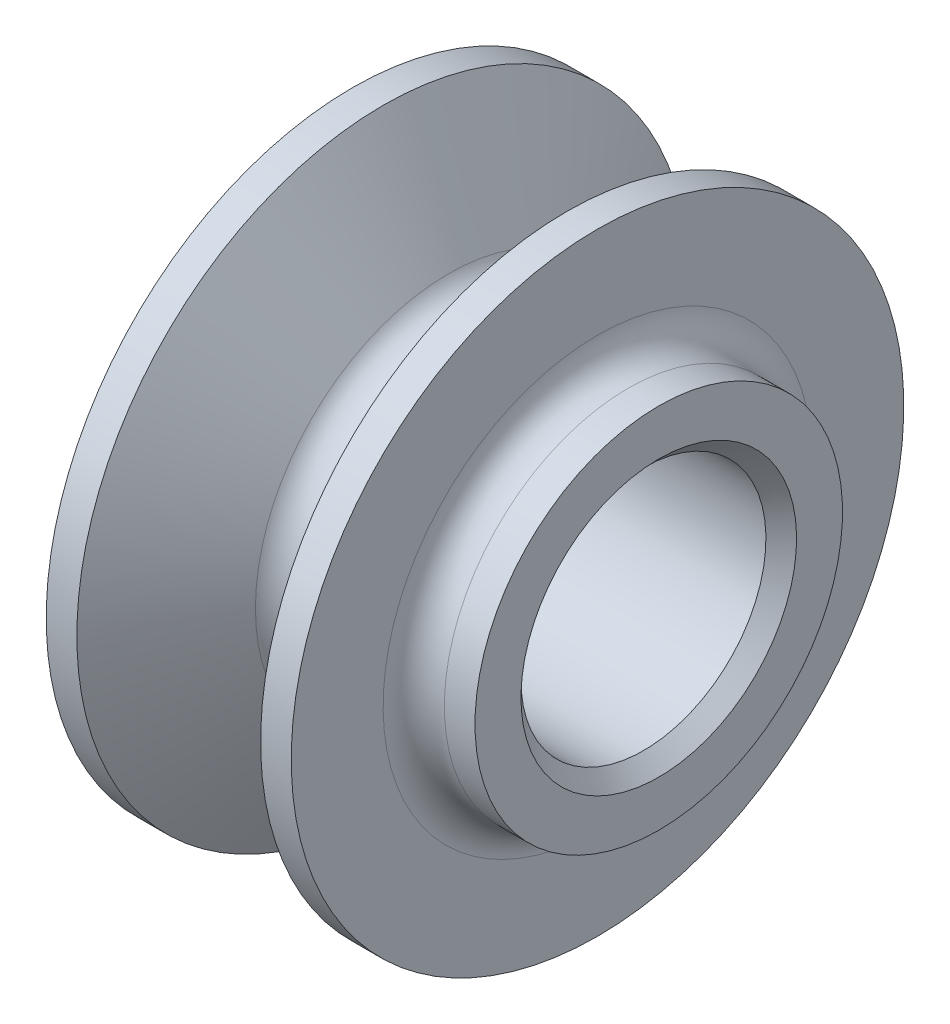
ISO-10303-21;
HEADER;
FILE_DESCRIPTION(('STEP AP214'),'2;1');
FILE_NAME('part.step','',(''),(''),'','','');
FILE_SCHEMA(('AUTOMOTIVE_DESIGN { 1 0 10303 214 1 1 1 1 }'));
ENDSEC;
DATA;
#1=APPLICATION_CONTEXT('core data for automotive mechanical design processes');
#2=APPLICATION_PROTOCOL_DEFINITION('international standard','automotive_design',2000,#1);
#3=PRODUCT_CONTEXT('',#1,'mechanical');
#4=PRODUCT('Part','Part','',(#3));
#5=PRODUCT_RELATED_PRODUCT_CATEGORY('part','',(#4));
#6=PRODUCT_DEFINITION_FORMATION('','',#4);
#7=PRODUCT_DEFINITION_CONTEXT('part definition',#1,'design');
#8=PRODUCT_DEFINITION('design','',#6,#7);
#9=PRODUCT_DEFINITION_SHAPE('','',#8);
#10=(LENGTH_UNIT() NAMED_UNIT(*) SI_UNIT(.MILLI.,.METRE.));
#11=(NAMED_UNIT(*) PLANE_ANGLE_UNIT() SI_UNIT($,.RADIAN.));
#12=(NAMED_UNIT(*) SI_UNIT($,.STERADIAN.) SOLID_ANGLE_UNIT());
#13=UNCERTAINTY_MEASURE_WITH_UNIT(LENGTH_MEASURE(1.E-05),#10,'distance_accuracy_value','');
#14=(GEOMETRIC_REPRESENTATION_CONTEXT(3) GLOBAL_UNCERTAINTY_ASSIGNED_CONTEXT((#13)) GLOBAL_UNIT_ASSIGNED_CONTEXT((#10,
#11,#12)) REPRESENTATION_CONTEXT('',''));
#15=CARTESIAN_POINT('',(0.,0.,0.));
#16=DIRECTION('',(0.,0.,1.));
#17=DIRECTION('',(1.,0.,0.));
#18=AXIS2_PLACEMENT_3D('',#15,#16,#17);
#19=CARTESIAN_POINT('',(0.,0.,0.));
#20=DIRECTION('',(1.,0.,0.));
#21=DIRECTION('',(0.,0.,-1.));
#22=AXIS2_PLACEMENT_3D('',#19,#20,#21);
#23=TOROIDAL_SURFACE('',#22,6.80384757729337,1.);
#24=CARTESIAN_POINT('',(-0.866025401573037,0.,0.));
#25=DIRECTION('',(-1.,0.,0.));
#26=DIRECTION('',(0.,1.,0.));
#27=AXIS2_PLACEMENT_3D('',#24,#25,#26);
#28=CIRCLE('',#27,6.30384757857013);
#29=CARTESIAN_POINT('',(-0.866025401573038,6.30384757857013,0.));
#30=VERTEX_POINT('',#29);
#31=EDGE_CURVE('E176',#30,#30,#28,.T.);
#32=ORIENTED_EDGE('',*,*,#31,.F.);
#33=EDGE_LOOP('',(#32));
#34=FACE_BOUND('',#33,.T.);
#35=CARTESIAN_POINT('',(0.866025401573036,0.,0.));
#36=DIRECTION('',(1.,0.,0.));
#37=DIRECTION('',(0.,1.,0.));
#38=AXIS2_PLACEMENT_3D('',#35,#36,#37);
#39=CIRCLE('',#38,6.30384757857013);
#40=CARTESIAN_POINT('',(0.866025401573034,6.30384757857013,0.));
#41=VERTEX_POINT('',#40);
#42=EDGE_CURVE('E173',#41,#41,#39,.T.);
#43=ORIENTED_EDGE('',*,*,#42,.F.);
#44=EDGE_LOOP('',(#43));
#45=FACE_BOUND('',#44,.T.);
#46=ADVANCED_FACE('F15',(#34,#45),#23,.F.);
#47=CARTESIAN_POINT('',(3.0000000022114,0.,0.));
#48=DIRECTION('',(1.,0.,0.));
#49=DIRECTION('',(0.,1.,0.));
#50=AXIS2_PLACEMENT_3D('',#47,#48,#49);
#51=CONICAL_SURFACE('',#50,9.99999999872325,1.04719755);
#52=CARTESIAN_POINT('',(3.,0.,0.));
#53=DIRECTION('',(1.,0.,0.));
#54=DIRECTION('',(0.,1.,0.));
#55=AXIS2_PLACEMENT_3D('',#52,#53,#54);
#56=CIRCLE('',#55,10.);
#57=CARTESIAN_POINT('',(3.,10.,0.));
#58=VERTEX_POINT('',#57);
#59=EDGE_CURVE('E181',#58,#58,#56,.T.);
#60=ORIENTED_EDGE('',*,*,#59,.F.);
#61=EDGE_LOOP('',(#60));
#62=FACE_BOUND('',#61,.T.);
#63=ORIENTED_EDGE('',*,*,#42,.T.);
#64=EDGE_LOOP('',(#63));
#65=FACE_BOUND('',#64,.T.);
#66=ADVANCED_FACE('F106',(#62,#65),#51,.T.);
#67=CARTESIAN_POINT('',(-3.00000000221141,0.,0.));
#68=DIRECTION('',(-1.,0.,0.));
#69=DIRECTION('',(0.,-1.,0.));
#70=AXIS2_PLACEMENT_3D('',#67,#68,#69);
#71=CONICAL_SURFACE('',#70,9.99999999872324,1.04719755);
#72=ORIENTED_EDGE('',*,*,#31,.T.);
#73=EDGE_LOOP('',(#72));
#74=FACE_BOUND('',#73,.T.);
#75=CARTESIAN_POINT('',(-3.,0.,0.));
#76=DIRECTION('',(1.,0.,0.));
#77=DIRECTION('',(0.,1.,0.));
#78=AXIS2_PLACEMENT_3D('',#75,#76,#77);
#79=CIRCLE('',#78,10.);
#80=CARTESIAN_POINT('',(-3.,10.,0.));
#81=VERTEX_POINT('',#80);
#82=EDGE_CURVE('E160',#81,#81,#79,.F.);
#83=ORIENTED_EDGE('',*,*,#82,.F.);
#84=EDGE_LOOP('',(#83));
#85=FACE_BOUND('',#84,.T.);
#86=ADVANCED_FACE('F103',(#74,#85),#71,.T.);
#87=CARTESIAN_POINT('',(3.5,0.,0.));
#88=DIRECTION('',(1.,0.,0.));
#89=DIRECTION('',(0.,1.,0.));
#90=AXIS2_PLACEMENT_3D('',#87,#88,#89);
#91=CYLINDRICAL_SURFACE('',#90,10.);
#92=ORIENTED_EDGE('',*,*,#59,.T.);
#93=EDGE_LOOP('',(#92));
#94=FACE_BOUND('',#93,.T.);
#95=CARTESIAN_POINT('',(4.,0.,0.));
#96=DIRECTION('',(1.,0.,0.));
#97=DIRECTION('',(0.,1.,0.));
#98=AXIS2_PLACEMENT_3D('',#95,#96,#97);
#99=CIRCLE('',#98,10.);
#100=CARTESIAN_POINT('',(4.,10.,0.));
#101=VERTEX_POINT('',#100);
#102=EDGE_CURVE('E19',#101,#101,#99,.T.);
#103=ORIENTED_EDGE('',*,*,#102,.F.);
#104=EDGE_LOOP('',(#103));
#105=FACE_BOUND('',#104,.T.);
#106=ADVANCED_FACE('F99',(#94,#105),#91,.T.);
#107=CARTESIAN_POINT('',(-3.5,0.,0.));
#108=DIRECTION('',(1.,0.,0.));
#109=DIRECTION('',(0.,1.,0.));
#110=AXIS2_PLACEMENT_3D('',#107,#108,#109);
#111=CYLINDRICAL_SURFACE('',#110,10.);
#112=CARTESIAN_POINT('',(-4.,0.,0.));
#113=DIRECTION('',(1.,0.,0.));
#114=DIRECTION('',(0.,1.,0.));
#115=AXIS2_PLACEMENT_3D('',#112,#113,#114);
#116=CIRCLE('',#115,10.);
#117=CARTESIAN_POINT('',(-4.,10.,0.));
#118=VERTEX_POINT('',#117);
#119=EDGE_CURVE('E155',#118,#118,#116,.F.);
#120=ORIENTED_EDGE('',*,*,#119,.F.);
#121=EDGE_LOOP('',(#120));
#122=FACE_BOUND('',#121,.T.);
#123=ORIENTED_EDGE('',*,*,#82,.T.);
#124=EDGE_LOOP('',(#123));
#125=FACE_BOUND('',#124,.T.);
#126=ADVANCED_FACE('F95',(#122,#125),#111,.T.);
#127=CARTESIAN_POINT('',(4.,8.5,0.));
#128=DIRECTION('',(1.,0.,0.));
#129=DIRECTION('',(0.,0.,-1.));
#130=AXIS2_PLACEMENT_3D('',#127,#128,#129);
#131=PLANE('',#130);
#132=CARTESIAN_POINT('',(4.,0.,0.));
#133=DIRECTION('',(1.,0.,0.));
#134=DIRECTION('',(0.,1.,0.));
#135=AXIS2_PLACEMENT_3D('',#132,#133,#134);
#136=CIRCLE('',#135,7.);
#137=CARTESIAN_POINT('',(4.,7.,0.));
#138=VERTEX_POINT('',#137);
#139=EDGE_CURVE('E79',#138,#138,#136,.F.);
#140=ORIENTED_EDGE('',*,*,#139,.T.);
#141=EDGE_LOOP('',(#140));
#142=FACE_BOUND('',#141,.T.);
#143=ORIENTED_EDGE('',*,*,#102,.T.);
#144=EDGE_LOOP('',(#143));
#145=FACE_BOUND('',#144,.T.);
#146=ADVANCED_FACE('F85',(#142,#145),#131,.T.);
#147=CARTESIAN_POINT('',(-4.,8.5,0.));
#148=DIRECTION('',(-1.,0.,0.));
#149=DIRECTION('',(0.,0.,1.));
#150=AXIS2_PLACEMENT_3D('',#147,#148,#149);
#151=PLANE('',#150);
#152=CARTESIAN_POINT('',(-4.,0.,0.));
#153=DIRECTION('',(-1.,0.,0.));
#154=DIRECTION('',(0.,1.,0.));
#155=AXIS2_PLACEMENT_3D('',#152,#153,#154);
#156=CIRCLE('',#155,7.);
#157=CARTESIAN_POINT('',(-4.,7.,0.));
#158=VERTEX_POINT('',#157);
#159=EDGE_CURVE('E44',#158,#158,#156,.F.);
#160=ORIENTED_EDGE('',*,*,#159,.T.);
#161=EDGE_LOOP('',(#160));
#162=FACE_BOUND('',#161,.T.);
#163=ORIENTED_EDGE('',*,*,#119,.T.);
#164=EDGE_LOOP('',(#163));
#165=FACE_BOUND('',#164,.T.);
#166=ADVANCED_FACE('F94',(#162,#165),#151,.T.);
#167=CARTESIAN_POINT('',(5.,0.,0.));
#168=DIRECTION('',(1.,0.,0.));
#169=DIRECTION('',(0.,0.,-1.));
#170=AXIS2_PLACEMENT_3D('',#167,#168,#169);
#171=TOROIDAL_SURFACE('',#170,7.,0.999999999999999);
#172=ORIENTED_EDGE('',*,*,#139,.F.);
#173=EDGE_LOOP('',(#172));
#174=FACE_BOUND('',#173,.T.);
#175=CARTESIAN_POINT('',(5.,0.,0.));
#176=DIRECTION('',(1.,0.,0.));
#177=DIRECTION('',(0.,1.,0.));
#178=AXIS2_PLACEMENT_3D('',#175,#176,#177);
#179=CIRCLE('',#178,6.);
#180=CARTESIAN_POINT('',(5.,6.00000000000001,0.));
#181=VERTEX_POINT('',#180);
#182=EDGE_CURVE('E39',#181,#181,#179,.T.);
#183=ORIENTED_EDGE('',*,*,#182,.F.);
#184=EDGE_LOOP('',(#183));
#185=FACE_BOUND('',#184,.T.);
#186=ADVANCED_FACE('F58',(#174,#185),#171,.F.);
#187=CARTESIAN_POINT('',(-5.,0.,0.));
#188=DIRECTION('',(1.,0.,0.));
#189=DIRECTION('',(0.,0.,-1.));
#190=AXIS2_PLACEMENT_3D('',#187,#188,#189);
#191=TOROIDAL_SURFACE('',#190,7.,0.999999999999999);
#192=CARTESIAN_POINT('',(-5.,0.,0.));
#193=DIRECTION('',(1.,0.,0.));
#194=DIRECTION('',(0.,1.,0.));
#195=AXIS2_PLACEMENT_3D('',#192,#193,#194);
#196=CIRCLE('',#195,6.);
#197=CARTESIAN_POINT('',(-5.,6.,0.));
#198=VERTEX_POINT('',#197);
#199=EDGE_CURVE('E35',#198,#198,#196,.F.);
#200=ORIENTED_EDGE('',*,*,#199,.F.);
#201=EDGE_LOOP('',(#200));
#202=FACE_BOUND('',#201,.T.);
#203=ORIENTED_EDGE('',*,*,#159,.F.);
#204=EDGE_LOOP('',(#203));
#205=FACE_BOUND('',#204,.T.);
#206=ADVANCED_FACE('F52',(#202,#205),#191,.F.);
#207=CARTESIAN_POINT('',(5.5,0.,0.));
#208=DIRECTION('',(1.,0.,0.));
#209=DIRECTION('',(0.,1.,0.));
#210=AXIS2_PLACEMENT_3D('',#207,#208,#209);
#211=CYLINDRICAL_SURFACE('',#210,6.);
#212=ORIENTED_EDGE('',*,*,#182,.T.);
#213=EDGE_LOOP('',(#212));
#214=FACE_BOUND('',#213,.T.);
#215=CARTESIAN_POINT('',(6.,0.,0.));
#216=DIRECTION('',(1.,0.,0.));
#217=DIRECTION('',(0.,1.,0.));
#218=AXIS2_PLACEMENT_3D('',#215,#216,#217);
#219=CIRCLE('',#218,6.);
#220=CARTESIAN_POINT('',(6.,6.00000000000001,0.));
#221=VERTEX_POINT('',#220);
#222=EDGE_CURVE('E38',#221,#221,#219,.T.);
#223=ORIENTED_EDGE('',*,*,#222,.F.);
#224=EDGE_LOOP('',(#223));
#225=FACE_BOUND('',#224,.T.);
#226=ADVANCED_FACE('F57',(#214,#225),#211,.T.);
#227=CARTESIAN_POINT('',(-5.5,0.,0.));
#228=DIRECTION('',(1.,0.,0.));
#229=DIRECTION('',(0.,1.,0.));
#230=AXIS2_PLACEMENT_3D('',#227,#228,#229);
#231=CYLINDRICAL_SURFACE('',#230,6.);
#232=CARTESIAN_POINT('',(-6.,0.,0.));
#233=DIRECTION('',(1.,0.,0.));
#234=DIRECTION('',(0.,1.,0.));
#235=AXIS2_PLACEMENT_3D('',#232,#233,#234);
#236=CIRCLE('',#235,6.);
#237=CARTESIAN_POINT('',(-6.,6.,0.));
#238=VERTEX_POINT('',#237);
#239=EDGE_CURVE('E150',#238,#238,#236,.F.);
#240=ORIENTED_EDGE('',*,*,#239,.F.);
#241=EDGE_LOOP('',(#240));
#242=FACE_BOUND('',#241,.T.);
#243=ORIENTED_EDGE('',*,*,#199,.T.);
#244=EDGE_LOOP('',(#243));
#245=FACE_BOUND('',#244,.T.);
#246=ADVANCED_FACE('F139',(#242,#245),#231,.T.);
#247=CARTESIAN_POINT('',(6.,5.,0.));
#248=DIRECTION('',(1.,0.,0.));
#249=DIRECTION('',(0.,0.,-1.));
#250=AXIS2_PLACEMENT_3D('',#247,#248,#249);
#251=PLANE('',#250);
#252=CARTESIAN_POINT('',(6.00000000025602,0.,0.));
#253=DIRECTION('',(1.,0.,0.));
#254=DIRECTION('',(0.,1.,0.));
#255=AXIS2_PLACEMENT_3D('',#252,#253,#254);
#256=CIRCLE('',#255,4.49999999983675);
#257=CARTESIAN_POINT('',(6.00000000025602,4.49999999983675,0.));
#258=VERTEX_POINT('',#257);
#259=EDGE_CURVE('E165',#258,#258,#256,.F.);
#260=ORIENTED_EDGE('',*,*,#259,.T.);
#261=EDGE_LOOP('',(#260));
#262=FACE_BOUND('',#261,.T.);
#263=ORIENTED_EDGE('',*,*,#222,.T.);
#264=EDGE_LOOP('',(#263));
#265=FACE_BOUND('',#264,.T.);
#266=ADVANCED_FACE('F136',(#262,#265),#251,.T.);
#267=CARTESIAN_POINT('',(-6.,5.,0.));
#268=DIRECTION('',(-1.,0.,0.));
#269=DIRECTION('',(0.,0.,1.));
#270=AXIS2_PLACEMENT_3D('',#267,#268,#269);
#271=PLANE('',#270);
#272=CARTESIAN_POINT('',(-6.00000000019918,0.,0.));
#273=DIRECTION('',(-1.,0.,0.));
#274=DIRECTION('',(0.,0.,1.));
#275=AXIS2_PLACEMENT_3D('',#272,#273,#274);
#276=CIRCLE('',#275,4.49999999983675);
#277=CARTESIAN_POINT('',(-6.00000000019918,0.,4.49999999983675));
#278=VERTEX_POINT('',#277);
#279=EDGE_CURVE('E28',#278,#278,#276,.F.);
#280=ORIENTED_EDGE('',*,*,#279,.T.);
#281=EDGE_LOOP('',(#280));
#282=FACE_BOUND('',#281,.T.);
#283=ORIENTED_EDGE('',*,*,#239,.T.);
#284=EDGE_LOOP('',(#283));
#285=FACE_BOUND('',#284,.T.);
#286=ADVANCED_FACE('F132',(#282,#285),#271,.T.);
#287=CARTESIAN_POINT('',(6.00000000014234,0.,0.));
#288=DIRECTION('',(1.,0.,0.));
#289=DIRECTION('',(0.,1.,0.));
#290=AXIS2_PLACEMENT_3D('',#287,#288,#289);
#291=CONICAL_SURFACE('',#290,4.49999999972306,0.785398162487954);
#292=CARTESIAN_POINT('',(5.5,0.,0.));
#293=DIRECTION('',(1.,0.,0.));
#294=DIRECTION('',(0.,1.,0.));
#295=AXIS2_PLACEMENT_3D('',#292,#293,#294);
#296=CIRCLE('',#295,4.);
#297=CARTESIAN_POINT('',(5.5,4.,0.));
#298=VERTEX_POINT('',#297);
#299=EDGE_CURVE('E23',#298,#298,#296,.F.);
#300=ORIENTED_EDGE('',*,*,#299,.T.);
#301=EDGE_LOOP('',(#300));
#302=FACE_BOUND('',#301,.T.);
#303=ORIENTED_EDGE('',*,*,#259,.F.);
#304=EDGE_LOOP('',(#303));
#305=FACE_BOUND('',#304,.T.);
#306=ADVANCED_FACE('F125',(#302,#305),#291,.F.);
#307=CARTESIAN_POINT('',(-6.00000000019918,0.,0.));
#308=DIRECTION('',(-1.,0.,0.));
#309=DIRECTION('',(0.,0.,1.));
#310=AXIS2_PLACEMENT_3D('',#307,#308,#309);
#311=CONICAL_SURFACE('',#310,4.49999999983675,0.785398162544797);
#312=ORIENTED_EDGE('',*,*,#279,.F.);
#313=EDGE_LOOP('',(#312));
#314=FACE_BOUND('',#313,.T.);
#315=CARTESIAN_POINT('',(-5.5,0.,0.));
#316=DIRECTION('',(1.,0.,0.));
#317=DIRECTION('',(0.,1.,0.));
#318=AXIS2_PLACEMENT_3D('',#315,#316,#317);
#319=CIRCLE('',#318,4.);
#320=CARTESIAN_POINT('',(-5.5,4.,0.));
#321=VERTEX_POINT('',#320);
#322=EDGE_CURVE('E10',#321,#321,#319,.T.);
#323=ORIENTED_EDGE('',*,*,#322,.T.);
#324=EDGE_LOOP('',(#323));
#325=FACE_BOUND('',#324,.T.);
#326=ADVANCED_FACE('F119',(#314,#325),#311,.F.);
#327=CARTESIAN_POINT('',(0.,0.,0.));
#328=DIRECTION('',(1.,0.,0.));
#329=DIRECTION('',(0.,1.,0.));
#330=AXIS2_PLACEMENT_3D('',#327,#328,#329);
#331=CYLINDRICAL_SURFACE('',#330,4.);
#332=ORIENTED_EDGE('',*,*,#322,.F.);
#333=EDGE_LOOP('',(#332));
#334=FACE_BOUND('',#333,.T.);
#335=ORIENTED_EDGE('',*,*,#299,.F.);
#336=EDGE_LOOP('',(#335));
#337=FACE_BOUND('',#336,.T.);
#338=ADVANCED_FACE('F117',(#334,#337),#331,.F.);
#339=CLOSED_SHELL('',(#46,#66,#86,#106,#126,#146,#166,#186,#206,#226,#246,#266,#286,#306,#326,#338));
#340=MANIFOLD_SOLID_BREP('B1',#339);
#341=ADVANCED_BREP_SHAPE_REPRESENTATION('',(#18,#340),#14);
#342=SHAPE_DEFINITION_REPRESENTATION(#9,#341);
ENDSEC;
END-ISO-10303-21;
